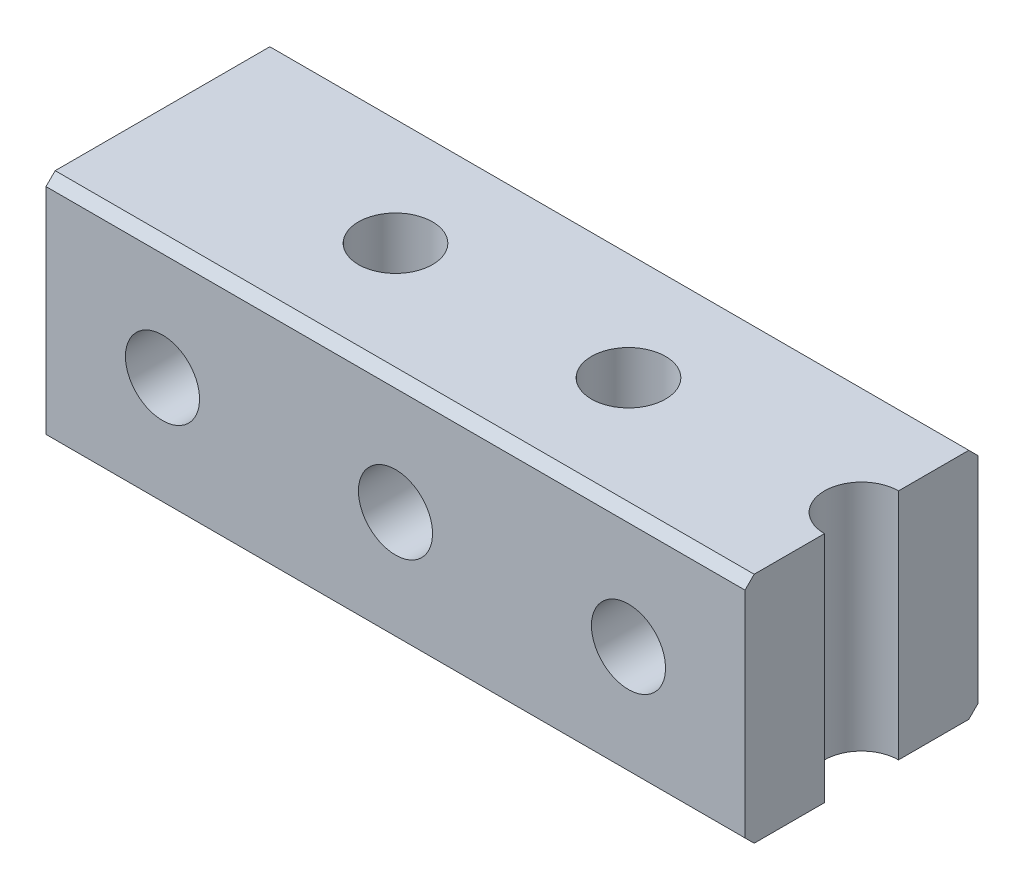
ISO-10303-21;
HEADER;
FILE_DESCRIPTION(('STEP AP214'),'2;1');
FILE_NAME('part.step','',(''),(''),'','','');
FILE_SCHEMA(('AUTOMOTIVE_DESIGN { 1 0 10303 214 1 1 1 1 }'));
ENDSEC;
DATA;
#1=APPLICATION_CONTEXT('core data for automotive mechanical design processes');
#2=APPLICATION_PROTOCOL_DEFINITION('international standard','automotive_design',2000,#1);
#3=PRODUCT_CONTEXT('',#1,'mechanical');
#4=PRODUCT('Part','Part','',(#3));
#5=PRODUCT_RELATED_PRODUCT_CATEGORY('part','',(#4));
#6=PRODUCT_DEFINITION_FORMATION('','',#4);
#7=PRODUCT_DEFINITION_CONTEXT('part definition',#1,'design');
#8=PRODUCT_DEFINITION('design','',#6,#7);
#9=PRODUCT_DEFINITION_SHAPE('','',#8);
#10=(LENGTH_UNIT() NAMED_UNIT(*) SI_UNIT(.MILLI.,.METRE.));
#11=(NAMED_UNIT(*) PLANE_ANGLE_UNIT() SI_UNIT($,.RADIAN.));
#12=(NAMED_UNIT(*) SI_UNIT($,.STERADIAN.) SOLID_ANGLE_UNIT());
#13=UNCERTAINTY_MEASURE_WITH_UNIT(LENGTH_MEASURE(1.E-05),#10,'distance_accuracy_value','');
#14=(GEOMETRIC_REPRESENTATION_CONTEXT(3) GLOBAL_UNCERTAINTY_ASSIGNED_CONTEXT((#13)) GLOBAL_UNIT_ASSIGNED_CONTEXT((#10,
#11,#12)) REPRESENTATION_CONTEXT('',''));
#15=CARTESIAN_POINT('',(0.,0.,0.));
#16=DIRECTION('',(0.,0.,1.));
#17=DIRECTION('',(1.,0.,0.));
#18=AXIS2_PLACEMENT_3D('',#15,#16,#17);
#19=CARTESIAN_POINT('',(19.05,0.,0.));
#20=DIRECTION('',(1.,0.,0.));
#21=DIRECTION('',(0.,1.,0.));
#22=AXIS2_PLACEMENT_3D('',#19,#20,#21);
#23=PLANE('',#22);
#24=DIRECTION('',(0.,1.,0.));
#25=VECTOR('',#24,1.);
#26=CARTESIAN_POINT('',(19.05,-6.35,2.0193));
#27=LINE('',#26,#25);
#28=CARTESIAN_POINT('',(19.05,6.35,2.0193));
#29=VERTEX_POINT('',#28);
#30=CARTESIAN_POINT('',(19.05,-6.35,2.0193));
#31=VERTEX_POINT('',#30);
#32=EDGE_CURVE('E11',#29,#31,#27,.F.);
#33=ORIENTED_EDGE('',*,*,#32,.F.);
#34=DIRECTION('',(0.,0.,-1.));
#35=VECTOR('',#34,1.);
#36=CARTESIAN_POINT('',(19.05,6.35,-2.925));
#37=LINE('',#36,#35);
#38=CARTESIAN_POINT('',(19.05,6.35,5.85));
#39=VERTEX_POINT('',#38);
#40=EDGE_CURVE('E208',#39,#29,#37,.T.);
#41=ORIENTED_EDGE('',*,*,#40,.F.);
#42=DIRECTION('',(0.,0.707106781186547,-0.707106781186548));
#43=VECTOR('',#42,1.);
#44=CARTESIAN_POINT('',(19.05,6.1,6.1));
#45=LINE('',#44,#43);
#46=CARTESIAN_POINT('',(19.05,5.85,6.35));
#47=VERTEX_POINT('',#46);
#48=EDGE_CURVE('E204',#47,#39,#45,.T.);
#49=ORIENTED_EDGE('',*,*,#48,.F.);
#50=DIRECTION('',(0.,1.,0.));
#51=VECTOR('',#50,1.);
#52=CARTESIAN_POINT('',(19.05,2.925,6.35));
#53=LINE('',#52,#51);
#54=CARTESIAN_POINT('',(19.05,-5.85,6.35));
#55=VERTEX_POINT('',#54);
#56=EDGE_CURVE('E200',#55,#47,#53,.T.);
#57=ORIENTED_EDGE('',*,*,#56,.F.);
#58=DIRECTION('',(0.,0.707106781186548,0.707106781186547));
#59=VECTOR('',#58,1.);
#60=CARTESIAN_POINT('',(19.05,-6.1,6.1));
#61=LINE('',#60,#59);
#62=CARTESIAN_POINT('',(19.05,-6.35,5.85));
#63=VERTEX_POINT('',#62);
#64=EDGE_CURVE('E196',#63,#55,#61,.T.);
#65=ORIENTED_EDGE('',*,*,#64,.F.);
#66=DIRECTION('',(0.,0.,1.));
#67=VECTOR('',#66,1.);
#68=CARTESIAN_POINT('',(19.05,-6.35,2.925));
#69=LINE('',#68,#67);
#70=EDGE_CURVE('E195',#31,#63,#69,.T.);
#71=ORIENTED_EDGE('',*,*,#70,.F.);
#72=EDGE_LOOP('',(#33,#41,#49,#57,#65,#71));
#73=FACE_BOUND('',#72,.T.);
#74=ADVANCED_FACE('F17',(#73),#23,.T.);
#75=CARTESIAN_POINT('',(133.35,6.1,-6.1));
#76=DIRECTION('',(0.,0.707106781186547,-0.707106781186548));
#77=DIRECTION('',(0.,0.707106781186548,0.707106781186547));
#78=AXIS2_PLACEMENT_3D('',#75,#76,#77);
#79=PLANE('',#78);
#80=DIRECTION('',(0.,-0.707106781186548,-0.707106781186547));
#81=VECTOR('',#80,1.);
#82=CARTESIAN_POINT('',(-19.05,6.1,-6.1));
#83=LINE('',#82,#81);
#84=CARTESIAN_POINT('',(-19.05,6.35,-5.85));
#85=VERTEX_POINT('',#84);
#86=CARTESIAN_POINT('',(-19.05,5.85,-6.35));
#87=VERTEX_POINT('',#86);
#88=EDGE_CURVE('E108',#85,#87,#83,.T.);
#89=ORIENTED_EDGE('',*,*,#88,.F.);
#90=DIRECTION('',(-1.,0.,0.));
#91=VECTOR('',#90,1.);
#92=CARTESIAN_POINT('',(133.35,6.35,-5.85));
#93=LINE('',#92,#91);
#94=CARTESIAN_POINT('',(19.05,6.35,-5.85));
#95=VERTEX_POINT('',#94);
#96=EDGE_CURVE('E93',#95,#85,#93,.T.);
#97=ORIENTED_EDGE('',*,*,#96,.F.);
#98=DIRECTION('',(0.,-0.707106781186548,-0.707106781186547));
#99=VECTOR('',#98,1.);
#100=CARTESIAN_POINT('',(19.05,6.1,-6.1));
#101=LINE('',#100,#99);
#102=CARTESIAN_POINT('',(19.05,5.85,-6.35));
#103=VERTEX_POINT('',#102);
#104=EDGE_CURVE('E148',#95,#103,#101,.T.);
#105=ORIENTED_EDGE('',*,*,#104,.T.);
#106=DIRECTION('',(-1.,0.,0.));
#107=VECTOR('',#106,1.);
#108=CARTESIAN_POINT('',(133.35,5.85,-6.35));
#109=LINE('',#108,#107);
#110=EDGE_CURVE('E110',#103,#87,#109,.T.);
#111=ORIENTED_EDGE('',*,*,#110,.T.);
#112=EDGE_LOOP('',(#89,#97,#105,#111));
#113=FACE_BOUND('',#112,.T.);
#114=ADVANCED_FACE('F109',(#113),#79,.T.);
#115=CARTESIAN_POINT('',(133.35,6.35,-2.925));
#116=DIRECTION('',(0.,1.,0.));
#117=DIRECTION('',(0.,0.,1.));
#118=AXIS2_PLACEMENT_3D('',#115,#116,#117);
#119=PLANE('',#118);
#120=CARTESIAN_POINT('',(-6.35,6.35,0.));
#121=DIRECTION('',(0.,1.,0.));
#122=DIRECTION('',(0.,0.,1.));
#123=AXIS2_PLACEMENT_3D('',#120,#121,#122);
#124=CIRCLE('',#123,2.0193);
#125=CARTESIAN_POINT('',(-6.35,6.35,2.0193));
#126=VERTEX_POINT('',#125);
#127=EDGE_CURVE('E115',#126,#126,#124,.F.);
#128=ORIENTED_EDGE('',*,*,#127,.T.);
#129=EDGE_LOOP('',(#128));
#130=FACE_BOUND('',#129,.T.);
#131=CARTESIAN_POINT('',(6.35,6.35,0.));
#132=DIRECTION('',(0.,1.,0.));
#133=DIRECTION('',(0.,0.,1.));
#134=AXIS2_PLACEMENT_3D('',#131,#132,#133);
#135=CIRCLE('',#134,2.0193);
#136=CARTESIAN_POINT('',(6.35,6.35,2.0193));
#137=VERTEX_POINT('',#136);
#138=EDGE_CURVE('E266',#137,#137,#135,.F.);
#139=ORIENTED_EDGE('',*,*,#138,.T.);
#140=EDGE_LOOP('',(#139));
#141=FACE_BOUND('',#140,.T.);
#142=DIRECTION('',(0.,0.,-1.));
#143=VECTOR('',#142,1.);
#144=CARTESIAN_POINT('',(-19.05,6.35,-2.925));
#145=LINE('',#144,#143);
#146=CARTESIAN_POINT('',(-19.05,6.35,5.85));
#147=VERTEX_POINT('',#146);
#148=EDGE_CURVE('E97',#147,#85,#145,.T.);
#149=ORIENTED_EDGE('',*,*,#148,.F.);
#150=DIRECTION('',(-1.,0.,0.));
#151=VECTOR('',#150,1.);
#152=CARTESIAN_POINT('',(133.35,6.35,5.85));
#153=LINE('',#152,#151);
#154=EDGE_CURVE('E105',#39,#147,#153,.T.);
#155=ORIENTED_EDGE('',*,*,#154,.F.);
#156=ORIENTED_EDGE('',*,*,#40,.T.);
#157=CARTESIAN_POINT('',(19.05,6.35,0.));
#158=DIRECTION('',(0.,1.,0.));
#159=DIRECTION('',(0.,0.,1.));
#160=AXIS2_PLACEMENT_3D('',#157,#158,#159);
#161=CIRCLE('',#160,2.0193);
#162=CARTESIAN_POINT('',(19.05,6.35,-2.0193));
#163=VERTEX_POINT('',#162);
#164=EDGE_CURVE('E247',#29,#163,#161,.F.);
#165=ORIENTED_EDGE('',*,*,#164,.T.);
#166=EDGE_CURVE('E100',#163,#95,#37,.T.);
#167=ORIENTED_EDGE('',*,*,#166,.T.);
#168=ORIENTED_EDGE('',*,*,#96,.T.);
#169=EDGE_LOOP('',(#149,#155,#156,#165,#167,#168));
#170=FACE_BOUND('',#169,.T.);
#171=ADVANCED_FACE('F95',(#130,#141,#170),#119,.T.);
#172=CARTESIAN_POINT('',(133.35,6.1,6.1));
#173=DIRECTION('',(0.,0.707106781186548,0.707106781186547));
#174=DIRECTION('',(0.,-0.707106781186547,0.707106781186548));
#175=AXIS2_PLACEMENT_3D('',#172,#173,#174);
#176=PLANE('',#175);
#177=DIRECTION('',(0.,0.707106781186547,-0.707106781186548));
#178=VECTOR('',#177,1.);
#179=CARTESIAN_POINT('',(-19.05,6.1,6.1));
#180=LINE('',#179,#178);
#181=CARTESIAN_POINT('',(-19.05,5.85,6.35));
#182=VERTEX_POINT('',#181);
#183=EDGE_CURVE('E120',#182,#147,#180,.T.);
#184=ORIENTED_EDGE('',*,*,#183,.F.);
#185=DIRECTION('',(-1.,0.,0.));
#186=VECTOR('',#185,1.);
#187=CARTESIAN_POINT('',(133.35,5.85,6.35));
#188=LINE('',#187,#186);
#189=EDGE_CURVE('E164',#47,#182,#188,.T.);
#190=ORIENTED_EDGE('',*,*,#189,.F.);
#191=ORIENTED_EDGE('',*,*,#48,.T.);
#192=ORIENTED_EDGE('',*,*,#154,.T.);
#193=EDGE_LOOP('',(#184,#190,#191,#192));
#194=FACE_BOUND('',#193,.T.);
#195=ADVANCED_FACE('F239',(#194),#176,.T.);
#196=CARTESIAN_POINT('',(133.35,2.925,6.35));
#197=DIRECTION('',(0.,0.,1.));
#198=DIRECTION('',(1.,0.,0.));
#199=AXIS2_PLACEMENT_3D('',#196,#197,#198);
#200=PLANE('',#199);
#201=CARTESIAN_POINT('',(-12.7,0.,6.35));
#202=DIRECTION('',(0.,0.,-1.));
#203=DIRECTION('',(-1.,0.,0.));
#204=AXIS2_PLACEMENT_3D('',#201,#202,#203);
#205=CIRCLE('',#204,2.0193);
#206=CARTESIAN_POINT('',(-14.7193,0.,6.35));
#207=VERTEX_POINT('',#206);
#208=EDGE_CURVE('E174',#207,#207,#205,.T.);
#209=ORIENTED_EDGE('',*,*,#208,.T.);
#210=EDGE_LOOP('',(#209));
#211=FACE_BOUND('',#210,.T.);
#212=CARTESIAN_POINT('',(0.,0.,6.35));
#213=DIRECTION('',(0.,0.,-1.));
#214=DIRECTION('',(-1.,0.,0.));
#215=AXIS2_PLACEMENT_3D('',#212,#213,#214);
#216=CIRCLE('',#215,2.0193);
#217=CARTESIAN_POINT('',(-2.0193,0.,6.35));
#218=VERTEX_POINT('',#217);
#219=EDGE_CURVE('E252',#218,#218,#216,.T.);
#220=ORIENTED_EDGE('',*,*,#219,.T.);
#221=EDGE_LOOP('',(#220));
#222=FACE_BOUND('',#221,.T.);
#223=CARTESIAN_POINT('',(12.7,0.,6.35));
#224=DIRECTION('',(0.,0.,-1.));
#225=DIRECTION('',(-1.,0.,0.));
#226=AXIS2_PLACEMENT_3D('',#223,#224,#225);
#227=CIRCLE('',#226,2.0193);
#228=CARTESIAN_POINT('',(10.6807,0.,6.35));
#229=VERTEX_POINT('',#228);
#230=EDGE_CURVE('E250',#229,#229,#227,.T.);
#231=ORIENTED_EDGE('',*,*,#230,.T.);
#232=EDGE_LOOP('',(#231));
#233=FACE_BOUND('',#232,.T.);
#234=DIRECTION('',(0.,1.,0.));
#235=VECTOR('',#234,1.);
#236=CARTESIAN_POINT('',(-19.05,2.925,6.35));
#237=LINE('',#236,#235);
#238=CARTESIAN_POINT('',(-19.05,-5.85,6.35));
#239=VERTEX_POINT('',#238);
#240=EDGE_CURVE('E127',#239,#182,#237,.T.);
#241=ORIENTED_EDGE('',*,*,#240,.F.);
#242=DIRECTION('',(-1.,0.,0.));
#243=VECTOR('',#242,1.);
#244=CARTESIAN_POINT('',(133.35,-5.85,6.35));
#245=LINE('',#244,#243);
#246=EDGE_CURVE('E161',#55,#239,#245,.T.);
#247=ORIENTED_EDGE('',*,*,#246,.F.);
#248=ORIENTED_EDGE('',*,*,#56,.T.);
#249=ORIENTED_EDGE('',*,*,#189,.T.);
#250=EDGE_LOOP('',(#241,#247,#248,#249));
#251=FACE_BOUND('',#250,.T.);
#252=ADVANCED_FACE('F236',(#211,#222,#233,#251),#200,.T.);
#253=CARTESIAN_POINT('',(133.35,-6.1,6.1));
#254=DIRECTION('',(0.,-0.707106781186547,0.707106781186548));
#255=DIRECTION('',(0.,-0.707106781186548,-0.707106781186547));
#256=AXIS2_PLACEMENT_3D('',#253,#254,#255);
#257=PLANE('',#256);
#258=DIRECTION('',(0.,0.707106781186548,0.707106781186547));
#259=VECTOR('',#258,1.);
#260=CARTESIAN_POINT('',(-19.05,-6.1,6.1));
#261=LINE('',#260,#259);
#262=CARTESIAN_POINT('',(-19.05,-6.35,5.85));
#263=VERTEX_POINT('',#262);
#264=EDGE_CURVE('E133',#263,#239,#261,.T.);
#265=ORIENTED_EDGE('',*,*,#264,.F.);
#266=DIRECTION('',(-1.,0.,0.));
#267=VECTOR('',#266,1.);
#268=CARTESIAN_POINT('',(133.35,-6.35,5.85));
#269=LINE('',#268,#267);
#270=EDGE_CURVE('E158',#63,#263,#269,.T.);
#271=ORIENTED_EDGE('',*,*,#270,.F.);
#272=ORIENTED_EDGE('',*,*,#64,.T.);
#273=ORIENTED_EDGE('',*,*,#246,.T.);
#274=EDGE_LOOP('',(#265,#271,#272,#273));
#275=FACE_BOUND('',#274,.T.);
#276=ADVANCED_FACE('F232',(#275),#257,.T.);
#277=CARTESIAN_POINT('',(133.35,-6.35,2.925));
#278=DIRECTION('',(0.,-1.,0.));
#279=DIRECTION('',(0.,0.,-1.));
#280=AXIS2_PLACEMENT_3D('',#277,#278,#279);
#281=PLANE('',#280);
#282=CARTESIAN_POINT('',(-6.35,-6.35,0.));
#283=DIRECTION('',(0.,1.,0.));
#284=DIRECTION('',(0.,0.,1.));
#285=AXIS2_PLACEMENT_3D('',#282,#283,#284);
#286=CIRCLE('',#285,2.0193);
#287=CARTESIAN_POINT('',(-6.35,-6.35,2.0193));
#288=VERTEX_POINT('',#287);
#289=EDGE_CURVE('E244',#288,#288,#286,.T.);
#290=ORIENTED_EDGE('',*,*,#289,.T.);
#291=EDGE_LOOP('',(#290));
#292=FACE_BOUND('',#291,.T.);
#293=CARTESIAN_POINT('',(6.35,-6.35,0.));
#294=DIRECTION('',(0.,1.,0.));
#295=DIRECTION('',(0.,0.,1.));
#296=AXIS2_PLACEMENT_3D('',#293,#294,#295);
#297=CIRCLE('',#296,2.0193);
#298=CARTESIAN_POINT('',(6.35,-6.35,2.0193));
#299=VERTEX_POINT('',#298);
#300=EDGE_CURVE('E218',#299,#299,#297,.T.);
#301=ORIENTED_EDGE('',*,*,#300,.T.);
#302=EDGE_LOOP('',(#301));
#303=FACE_BOUND('',#302,.T.);
#304=DIRECTION('',(0.,0.,1.));
#305=VECTOR('',#304,1.);
#306=CARTESIAN_POINT('',(-19.05,-6.35,2.925));
#307=LINE('',#306,#305);
#308=CARTESIAN_POINT('',(-19.05,-6.35,-5.85));
#309=VERTEX_POINT('',#308);
#310=EDGE_CURVE('E137',#309,#263,#307,.T.);
#311=ORIENTED_EDGE('',*,*,#310,.F.);
#312=DIRECTION('',(-1.,0.,0.));
#313=VECTOR('',#312,1.);
#314=CARTESIAN_POINT('',(133.35,-6.35,-5.85));
#315=LINE('',#314,#313);
#316=CARTESIAN_POINT('',(19.05,-6.35,-5.85));
#317=VERTEX_POINT('',#316);
#318=EDGE_CURVE('E155',#317,#309,#315,.T.);
#319=ORIENTED_EDGE('',*,*,#318,.F.);
#320=CARTESIAN_POINT('',(19.05,-6.35,-2.0193));
#321=VERTEX_POINT('',#320);
#322=EDGE_CURVE('E191',#317,#321,#69,.T.);
#323=ORIENTED_EDGE('',*,*,#322,.T.);
#324=CARTESIAN_POINT('',(19.05,-6.35,0.));
#325=DIRECTION('',(0.,1.,0.));
#326=DIRECTION('',(0.,0.,1.));
#327=AXIS2_PLACEMENT_3D('',#324,#325,#326);
#328=CIRCLE('',#327,2.0193);
#329=EDGE_CURVE('E181',#321,#31,#328,.T.);
#330=ORIENTED_EDGE('',*,*,#329,.T.);
#331=ORIENTED_EDGE('',*,*,#70,.T.);
#332=ORIENTED_EDGE('',*,*,#270,.T.);
#333=EDGE_LOOP('',(#311,#319,#323,#330,#331,#332));
#334=FACE_BOUND('',#333,.T.);
#335=ADVANCED_FACE('F221',(#292,#303,#334),#281,.T.);
#336=CARTESIAN_POINT('',(133.35,-6.1,-6.1));
#337=DIRECTION('',(0.,-0.707106781186548,-0.707106781186547));
#338=DIRECTION('',(0.,0.707106781186547,-0.707106781186548));
#339=AXIS2_PLACEMENT_3D('',#336,#337,#338);
#340=PLANE('',#339);
#341=DIRECTION('',(0.,-0.707106781186547,0.707106781186548));
#342=VECTOR('',#341,1.);
#343=CARTESIAN_POINT('',(-19.05,-6.1,-6.1));
#344=LINE('',#343,#342);
#345=CARTESIAN_POINT('',(-19.05,-5.85,-6.35));
#346=VERTEX_POINT('',#345);
#347=EDGE_CURVE('E141',#346,#309,#344,.T.);
#348=ORIENTED_EDGE('',*,*,#347,.F.);
#349=DIRECTION('',(-1.,0.,0.));
#350=VECTOR('',#349,1.);
#351=CARTESIAN_POINT('',(133.35,-5.85,-6.35));
#352=LINE('',#351,#350);
#353=CARTESIAN_POINT('',(19.05,-5.85,-6.35));
#354=VERTEX_POINT('',#353);
#355=EDGE_CURVE('E151',#354,#346,#352,.T.);
#356=ORIENTED_EDGE('',*,*,#355,.F.);
#357=DIRECTION('',(0.,-0.707106781186547,0.707106781186548));
#358=VECTOR('',#357,1.);
#359=CARTESIAN_POINT('',(19.05,-6.1,-6.1));
#360=LINE('',#359,#358);
#361=EDGE_CURVE('E187',#354,#317,#360,.T.);
#362=ORIENTED_EDGE('',*,*,#361,.T.);
#363=ORIENTED_EDGE('',*,*,#318,.T.);
#364=EDGE_LOOP('',(#348,#356,#362,#363));
#365=FACE_BOUND('',#364,.T.);
#366=ADVANCED_FACE('F224',(#365),#340,.T.);
#367=CARTESIAN_POINT('',(133.35,-2.925,-6.35));
#368=DIRECTION('',(0.,0.,-1.));
#369=DIRECTION('',(-1.,0.,0.));
#370=AXIS2_PLACEMENT_3D('',#367,#368,#369);
#371=PLANE('',#370);
#372=CARTESIAN_POINT('',(-12.7,0.,-6.35));
#373=DIRECTION('',(0.,0.,-1.));
#374=DIRECTION('',(-1.,0.,0.));
#375=AXIS2_PLACEMENT_3D('',#372,#373,#374);
#376=CIRCLE('',#375,2.0193);
#377=CARTESIAN_POINT('',(-14.7193,0.,-6.35));
#378=VERTEX_POINT('',#377);
#379=EDGE_CURVE('E177',#378,#378,#376,.F.);
#380=ORIENTED_EDGE('',*,*,#379,.T.);
#381=EDGE_LOOP('',(#380));
#382=FACE_BOUND('',#381,.T.);
#383=CARTESIAN_POINT('',(0.,0.,-6.35));
#384=DIRECTION('',(0.,0.,-1.));
#385=DIRECTION('',(-1.,0.,0.));
#386=AXIS2_PLACEMENT_3D('',#383,#384,#385);
#387=CIRCLE('',#386,2.0193);
#388=CARTESIAN_POINT('',(-2.0193,0.,-6.35));
#389=VERTEX_POINT('',#388);
#390=EDGE_CURVE('E173',#389,#389,#387,.F.);
#391=ORIENTED_EDGE('',*,*,#390,.T.);
#392=EDGE_LOOP('',(#391));
#393=FACE_BOUND('',#392,.T.);
#394=CARTESIAN_POINT('',(12.7,0.,-6.35));
#395=DIRECTION('',(0.,0.,-1.));
#396=DIRECTION('',(-1.,0.,0.));
#397=AXIS2_PLACEMENT_3D('',#394,#395,#396);
#398=CIRCLE('',#397,2.0193);
#399=CARTESIAN_POINT('',(10.6807,0.,-6.35));
#400=VERTEX_POINT('',#399);
#401=EDGE_CURVE('E169',#400,#400,#398,.F.);
#402=ORIENTED_EDGE('',*,*,#401,.T.);
#403=EDGE_LOOP('',(#402));
#404=FACE_BOUND('',#403,.T.);
#405=DIRECTION('',(0.,-1.,0.));
#406=VECTOR('',#405,1.);
#407=CARTESIAN_POINT('',(-19.05,-2.925,-6.35));
#408=LINE('',#407,#406);
#409=EDGE_CURVE('E145',#87,#346,#408,.T.);
#410=ORIENTED_EDGE('',*,*,#409,.F.);
#411=ORIENTED_EDGE('',*,*,#110,.F.);
#412=DIRECTION('',(0.,-1.,0.));
#413=VECTOR('',#412,1.);
#414=CARTESIAN_POINT('',(19.05,-2.925,-6.35));
#415=LINE('',#414,#413);
#416=EDGE_CURVE('E152',#103,#354,#415,.T.);
#417=ORIENTED_EDGE('',*,*,#416,.T.);
#418=ORIENTED_EDGE('',*,*,#355,.T.);
#419=EDGE_LOOP('',(#410,#411,#417,#418));
#420=FACE_BOUND('',#419,.T.);
#421=ADVANCED_FACE('F227',(#382,#393,#404,#420),#371,.T.);
#422=ORIENTED_EDGE('',*,*,#166,.F.);
#423=DIRECTION('',(0.,1.,0.));
#424=VECTOR('',#423,1.);
#425=CARTESIAN_POINT('',(19.05,-6.35,-2.0193));
#426=LINE('',#425,#424);
#427=EDGE_CURVE('E26',#163,#321,#426,.F.);
#428=ORIENTED_EDGE('',*,*,#427,.T.);
#429=ORIENTED_EDGE('',*,*,#322,.F.);
#430=ORIENTED_EDGE('',*,*,#361,.F.);
#431=ORIENTED_EDGE('',*,*,#416,.F.);
#432=ORIENTED_EDGE('',*,*,#104,.F.);
#433=EDGE_LOOP('',(#422,#428,#429,#430,#431,#432));
#434=FACE_BOUND('',#433,.T.);
#435=ADVANCED_FACE('F19',(#434),#23,.T.);
#436=CARTESIAN_POINT('',(-19.05,0.,0.));
#437=DIRECTION('',(1.,0.,0.));
#438=DIRECTION('',(0.,1.,0.));
#439=AXIS2_PLACEMENT_3D('',#436,#437,#438);
#440=PLANE('',#439);
#441=ORIENTED_EDGE('',*,*,#88,.T.);
#442=ORIENTED_EDGE('',*,*,#409,.T.);
#443=ORIENTED_EDGE('',*,*,#347,.T.);
#444=ORIENTED_EDGE('',*,*,#310,.T.);
#445=ORIENTED_EDGE('',*,*,#264,.T.);
#446=ORIENTED_EDGE('',*,*,#240,.T.);
#447=ORIENTED_EDGE('',*,*,#183,.T.);
#448=ORIENTED_EDGE('',*,*,#148,.T.);
#449=EDGE_LOOP('',(#441,#442,#443,#444,#445,#446,#447,#448));
#450=FACE_BOUND('',#449,.T.);
#451=ADVANCED_FACE('F117',(#450),#440,.F.);
#452=CARTESIAN_POINT('',(19.05,-6.35,0.));
#453=DIRECTION('',(0.,1.,0.));
#454=DIRECTION('',(0.,0.,1.));
#455=AXIS2_PLACEMENT_3D('',#452,#453,#454);
#456=CYLINDRICAL_SURFACE('',#455,2.0193);
#457=ORIENTED_EDGE('',*,*,#164,.F.);
#458=ORIENTED_EDGE('',*,*,#32,.T.);
#459=ORIENTED_EDGE('',*,*,#329,.F.);
#460=ORIENTED_EDGE('',*,*,#427,.F.);
#461=EDGE_LOOP('',(#457,#458,#459,#460));
#462=FACE_BOUND('',#461,.T.);
#463=ADVANCED_FACE('F216',(#462),#456,.F.);
#464=CARTESIAN_POINT('',(6.35,-6.35,0.));
#465=DIRECTION('',(0.,1.,0.));
#466=DIRECTION('',(0.,0.,1.));
#467=AXIS2_PLACEMENT_3D('',#464,#465,#466);
#468=CYLINDRICAL_SURFACE('',#467,2.0193);
#469=ORIENTED_EDGE('',*,*,#138,.F.);
#470=EDGE_LOOP('',(#469));
#471=FACE_BOUND('',#470,.T.);
#472=ORIENTED_EDGE('',*,*,#300,.F.);
#473=EDGE_LOOP('',(#472));
#474=FACE_BOUND('',#473,.T.);
#475=ADVANCED_FACE('F279',(#471,#474),#468,.F.);
#476=CARTESIAN_POINT('',(-6.35,-6.35,0.));
#477=DIRECTION('',(0.,1.,0.));
#478=DIRECTION('',(0.,0.,1.));
#479=AXIS2_PLACEMENT_3D('',#476,#477,#478);
#480=CYLINDRICAL_SURFACE('',#479,2.0193);
#481=ORIENTED_EDGE('',*,*,#127,.F.);
#482=EDGE_LOOP('',(#481));
#483=FACE_BOUND('',#482,.T.);
#484=ORIENTED_EDGE('',*,*,#289,.F.);
#485=EDGE_LOOP('',(#484));
#486=FACE_BOUND('',#485,.T.);
#487=ADVANCED_FACE('F275',(#483,#486),#480,.F.);
#488=CARTESIAN_POINT('',(12.7,0.,6.35));
#489=DIRECTION('',(0.,0.,-1.));
#490=DIRECTION('',(-1.,0.,0.));
#491=AXIS2_PLACEMENT_3D('',#488,#489,#490);
#492=CYLINDRICAL_SURFACE('',#491,2.0193);
#493=ORIENTED_EDGE('',*,*,#401,.F.);
#494=EDGE_LOOP('',(#493));
#495=FACE_BOUND('',#494,.T.);
#496=ORIENTED_EDGE('',*,*,#230,.F.);
#497=EDGE_LOOP('',(#496));
#498=FACE_BOUND('',#497,.T.);
#499=ADVANCED_FACE('F278',(#495,#498),#492,.F.);
#500=CARTESIAN_POINT('',(0.,0.,6.35));
#501=DIRECTION('',(0.,0.,-1.));
#502=DIRECTION('',(-1.,0.,0.));
#503=AXIS2_PLACEMENT_3D('',#500,#501,#502);
#504=CYLINDRICAL_SURFACE('',#503,2.0193);
#505=ORIENTED_EDGE('',*,*,#390,.F.);
#506=EDGE_LOOP('',(#505));
#507=FACE_BOUND('',#506,.T.);
#508=ORIENTED_EDGE('',*,*,#219,.F.);
#509=EDGE_LOOP('',(#508));
#510=FACE_BOUND('',#509,.T.);
#511=ADVANCED_FACE('F378',(#507,#510),#504,.F.);
#512=CARTESIAN_POINT('',(-12.7,0.,6.35));
#513=DIRECTION('',(0.,0.,-1.));
#514=DIRECTION('',(-1.,0.,0.));
#515=AXIS2_PLACEMENT_3D('',#512,#513,#514);
#516=CYLINDRICAL_SURFACE('',#515,2.0193);
#517=ORIENTED_EDGE('',*,*,#379,.F.);
#518=EDGE_LOOP('',(#517));
#519=FACE_BOUND('',#518,.T.);
#520=ORIENTED_EDGE('',*,*,#208,.F.);
#521=EDGE_LOOP('',(#520));
#522=FACE_BOUND('',#521,.T.);
#523=ADVANCED_FACE('F387',(#519,#522),#516,.F.);
#524=CLOSED_SHELL('',(#74,#114,#171,#195,#252,#276,#335,#366,#421,#435,#451,#463,#475,#487,#499,
#511,#523));
#525=MANIFOLD_SOLID_BREP('B1',#524);
#526=ADVANCED_BREP_SHAPE_REPRESENTATION('',(#18,#525),#14);
#527=SHAPE_DEFINITION_REPRESENTATION(#9,#526);
ENDSEC;
END-ISO-10303-21;
